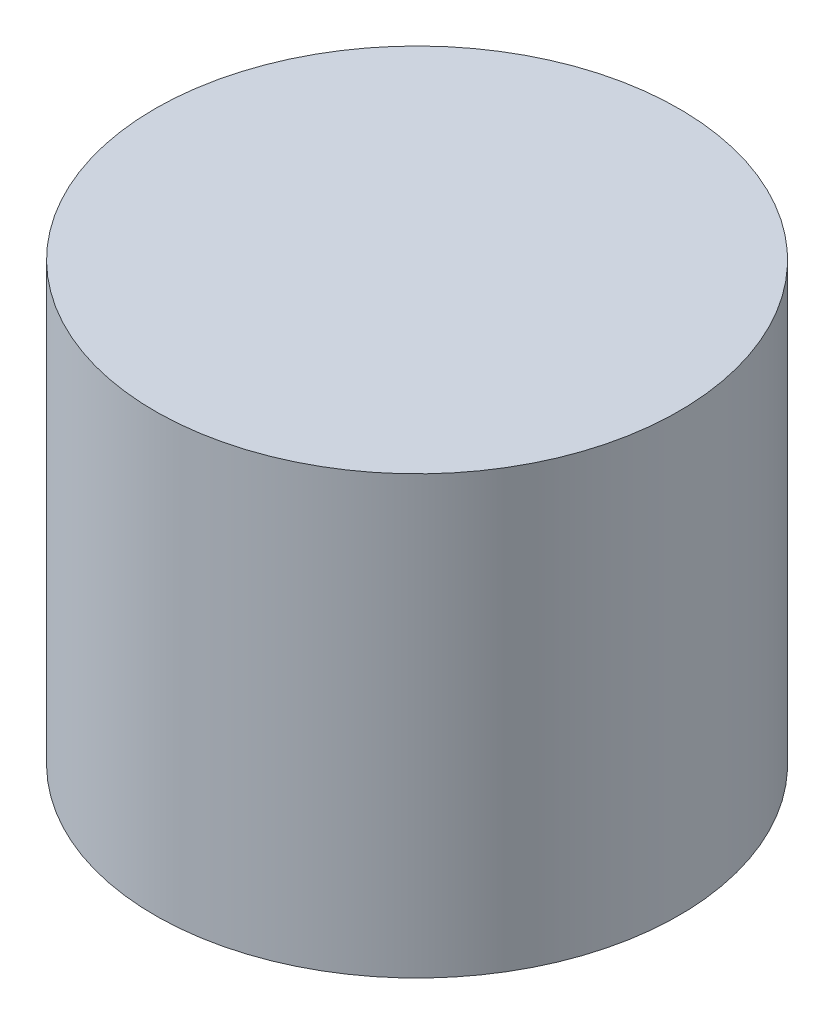
ISO-10303-21;
HEADER;
FILE_DESCRIPTION(('STEP AP214'),'2;1');
FILE_NAME('part.step','',(''),(''),'','','');
FILE_SCHEMA(('AUTOMOTIVE_DESIGN { 1 0 10303 214 1 1 1 1 }'));
ENDSEC;
DATA;
#1=APPLICATION_CONTEXT('core data for automotive mechanical design processes');
#2=APPLICATION_PROTOCOL_DEFINITION('international standard','automotive_design',2000,#1);
#3=PRODUCT_CONTEXT('',#1,'mechanical');
#4=PRODUCT('Part','Part','',(#3));
#5=PRODUCT_RELATED_PRODUCT_CATEGORY('part','',(#4));
#6=PRODUCT_DEFINITION_FORMATION('','',#4);
#7=PRODUCT_DEFINITION_CONTEXT('part definition',#1,'design');
#8=PRODUCT_DEFINITION('design','',#6,#7);
#9=PRODUCT_DEFINITION_SHAPE('','',#8);
#10=(LENGTH_UNIT() NAMED_UNIT(*) SI_UNIT(.MILLI.,.METRE.));
#11=(NAMED_UNIT(*) PLANE_ANGLE_UNIT() SI_UNIT($,.RADIAN.));
#12=(NAMED_UNIT(*) SI_UNIT($,.STERADIAN.) SOLID_ANGLE_UNIT());
#13=UNCERTAINTY_MEASURE_WITH_UNIT(LENGTH_MEASURE(1.E-05),#10,'distance_accuracy_value','');
#14=(GEOMETRIC_REPRESENTATION_CONTEXT(3) GLOBAL_UNCERTAINTY_ASSIGNED_CONTEXT((#13)) GLOBAL_UNIT_ASSIGNED_CONTEXT((#10,
#11,#12)) REPRESENTATION_CONTEXT('',''));
#15=CARTESIAN_POINT('',(0.,0.,0.));
#16=DIRECTION('',(0.,0.,1.));
#17=DIRECTION('',(1.,0.,0.));
#18=AXIS2_PLACEMENT_3D('',#15,#16,#17);
#19=CARTESIAN_POINT('',(-10.4929619961535,8.4168226065985,0.));
#20=DIRECTION('',(0.,1.,0.));
#21=DIRECTION('',(-1.,0.,0.));
#22=AXIS2_PLACEMENT_3D('',#19,#20,#21);
#23=PLANE('',#22);
#24=CARTESIAN_POINT('',(19.5070380038465,8.4168226065985,0.));
#25=DIRECTION('',(0.,1.,0.));
#26=DIRECTION('',(-1.,0.,0.));
#27=AXIS2_PLACEMENT_3D('',#24,#25,#26);
#28=CIRCLE('',#27,30.);
#29=CARTESIAN_POINT('',(-10.4929619961535,8.41682260659849,0.));
#30=VERTEX_POINT('',#29);
#31=EDGE_CURVE('E40',#30,#30,#28,.T.);
#32=ORIENTED_EDGE('',*,*,#31,.T.);
#33=EDGE_LOOP('',(#32));
#34=FACE_BOUND('',#33,.T.);
#35=ADVANCED_FACE('F34',(#34),#23,.T.);
#36=CARTESIAN_POINT('',(-10.4929619961535,-41.5831773934015,0.));
#37=DIRECTION('',(0.,-1.,0.));
#38=DIRECTION('',(1.,0.,0.));
#39=AXIS2_PLACEMENT_3D('',#36,#37,#38);
#40=PLANE('',#39);
#41=CARTESIAN_POINT('',(19.5070380038465,-41.5831773934015,0.));
#42=DIRECTION('',(0.,1.,0.));
#43=DIRECTION('',(-1.,0.,0.));
#44=AXIS2_PLACEMENT_3D('',#41,#42,#43);
#45=CIRCLE('',#44,30.);
#46=CARTESIAN_POINT('',(-10.4929619961535,-41.5831773934015,0.));
#47=VERTEX_POINT('',#46);
#48=EDGE_CURVE('E10',#47,#47,#45,.T.);
#49=ORIENTED_EDGE('',*,*,#48,.F.);
#50=EDGE_LOOP('',(#49));
#51=FACE_BOUND('',#50,.T.);
#52=ADVANCED_FACE('F49',(#51),#40,.T.);
#53=CARTESIAN_POINT('',(19.5070380038465,8.4168226065985,0.));
#54=DIRECTION('',(0.,1.,0.));
#55=DIRECTION('',(-1.,0.,0.));
#56=AXIS2_PLACEMENT_3D('',#53,#54,#55);
#57=CYLINDRICAL_SURFACE('',#56,30.);
#58=ORIENTED_EDGE('',*,*,#48,.T.);
#59=EDGE_LOOP('',(#58));
#60=FACE_BOUND('',#59,.T.);
#61=ORIENTED_EDGE('',*,*,#31,.F.);
#62=EDGE_LOOP('',(#61));
#63=FACE_BOUND('',#62,.T.);
#64=ADVANCED_FACE('F47',(#60,#63),#57,.T.);
#65=CLOSED_SHELL('',(#35,#52,#64));
#66=MANIFOLD_SOLID_BREP('B2',#65);
#67=ADVANCED_BREP_SHAPE_REPRESENTATION('',(#18,#66),#14);
#68=SHAPE_DEFINITION_REPRESENTATION(#9,#67);
ENDSEC;
END-ISO-10303-21;
